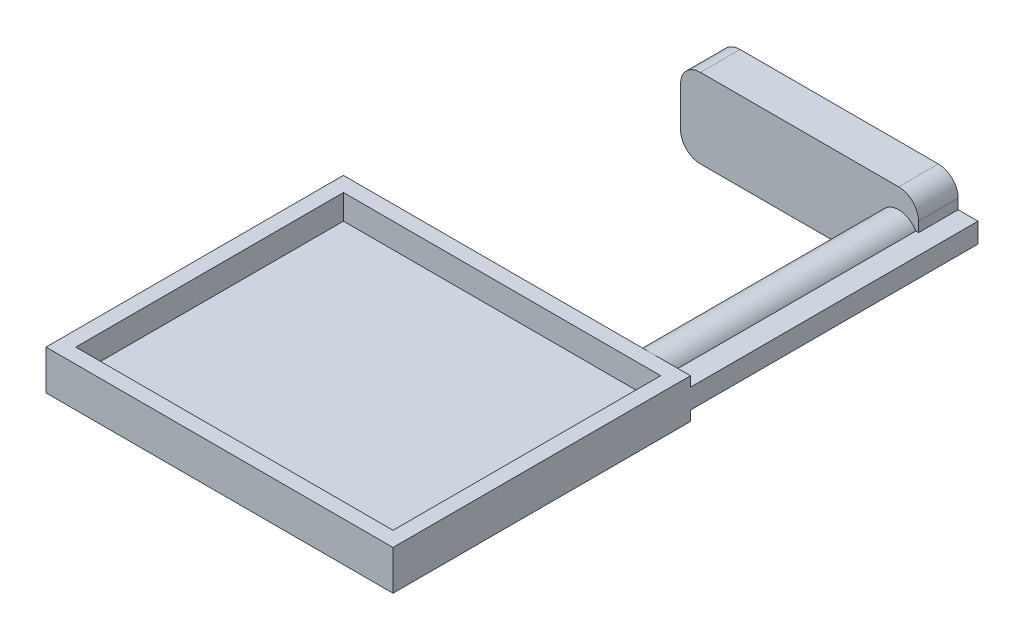
ISO-10303-21;
HEADER;
FILE_DESCRIPTION(('STEP AP214'),'2;1');
FILE_NAME('part.step','',(''),(''),'','','');
FILE_SCHEMA(('AUTOMOTIVE_DESIGN { 1 0 10303 214 1 1 1 1 }'));
ENDSEC;
DATA;
#1=APPLICATION_CONTEXT('core data for automotive mechanical design processes');
#2=APPLICATION_PROTOCOL_DEFINITION('international standard','automotive_design',2000,#1);
#3=PRODUCT_CONTEXT('',#1,'mechanical');
#4=PRODUCT('Part','Part','',(#3));
#5=PRODUCT_RELATED_PRODUCT_CATEGORY('part','',(#4));
#6=PRODUCT_DEFINITION_FORMATION('','',#4);
#7=PRODUCT_DEFINITION_CONTEXT('part definition',#1,'design');
#8=PRODUCT_DEFINITION('design','',#6,#7);
#9=PRODUCT_DEFINITION_SHAPE('','',#8);
#10=(LENGTH_UNIT() NAMED_UNIT(*) SI_UNIT(.MILLI.,.METRE.));
#11=(NAMED_UNIT(*) PLANE_ANGLE_UNIT() SI_UNIT($,.RADIAN.));
#12=(NAMED_UNIT(*) SI_UNIT($,.STERADIAN.) SOLID_ANGLE_UNIT());
#13=UNCERTAINTY_MEASURE_WITH_UNIT(LENGTH_MEASURE(1.E-05),#10,'distance_accuracy_value','');
#14=(GEOMETRIC_REPRESENTATION_CONTEXT(3) GLOBAL_UNCERTAINTY_ASSIGNED_CONTEXT((#13)) GLOBAL_UNIT_ASSIGNED_CONTEXT((#10,
#11,#12)) REPRESENTATION_CONTEXT('',''));
#15=CARTESIAN_POINT('',(0.,0.,0.));
#16=DIRECTION('',(0.,0.,1.));
#17=DIRECTION('',(1.,0.,0.));
#18=AXIS2_PLACEMENT_3D('',#15,#16,#17);
#19=CARTESIAN_POINT('',(3.99999999999998,4.00000000000002,-58.));
#20=DIRECTION('',(-1.,0.,0.));
#21=DIRECTION('',(0.,0.,1.));
#22=AXIS2_PLACEMENT_3D('',#19,#20,#21);
#23=PLANE('',#22);
#24=DIRECTION('',(0.,0.,1.));
#25=VECTOR('',#24,1.);
#26=CARTESIAN_POINT('',(3.99999999999998,-2.,-63.6568542494924));
#27=LINE('',#26,#25);
#28=CARTESIAN_POINT('',(3.99999999999998,-2.,-58.));
#29=VERTEX_POINT('',#28);
#30=CARTESIAN_POINT('',(3.99999999999998,-2.,-50.));
#31=VERTEX_POINT('',#30);
#32=EDGE_CURVE('E328',#29,#31,#27,.T.);
#33=ORIENTED_EDGE('',*,*,#32,.T.);
#34=DIRECTION('',(0.,-1.,0.));
#35=VECTOR('',#34,1.);
#36=CARTESIAN_POINT('',(3.99999999999998,4.00000000000002,-50.));
#37=LINE('',#36,#35);
#38=CARTESIAN_POINT('',(3.99999999999998,-4.00000000000002,-50.));
#39=VERTEX_POINT('',#38);
#40=EDGE_CURVE('E366',#31,#39,#37,.T.);
#41=ORIENTED_EDGE('',*,*,#40,.T.);
#42=DIRECTION('',(0.,0.,1.));
#43=VECTOR('',#42,1.);
#44=CARTESIAN_POINT('',(3.99999999999998,-4.00000000000002,-58.));
#45=LINE('',#44,#43);
#46=CARTESIAN_POINT('',(3.99999999999998,-4.00000000000002,-58.));
#47=VERTEX_POINT('',#46);
#48=EDGE_CURVE('E398',#47,#39,#45,.T.);
#49=ORIENTED_EDGE('',*,*,#48,.F.);
#50=DIRECTION('',(0.,-1.,0.));
#51=VECTOR('',#50,1.);
#52=CARTESIAN_POINT('',(3.99999999999998,4.00000000000002,-58.));
#53=LINE('',#52,#51);
#54=EDGE_CURVE('E346',#29,#47,#53,.T.);
#55=ORIENTED_EDGE('',*,*,#54,.F.);
#56=EDGE_LOOP('',(#33,#41,#49,#55));
#57=FACE_BOUND('',#56,.T.);
#58=ADVANCED_FACE('F41',(#57),#23,.F.);
#59=DIRECTION('',(0.,0.,1.));
#60=VECTOR('',#59,1.);
#61=CARTESIAN_POINT('',(3.99999999999998,2.,-63.6568542494924));
#62=LINE('',#61,#60);
#63=CARTESIAN_POINT('',(3.99999999999998,2.,-58.));
#64=VERTEX_POINT('',#63);
#65=CARTESIAN_POINT('',(3.99999999999998,2.,-50.));
#66=VERTEX_POINT('',#65);
#67=EDGE_CURVE('E339',#64,#66,#62,.T.);
#68=ORIENTED_EDGE('',*,*,#67,.F.);
#69=CARTESIAN_POINT('',(3.99999999999998,4.00000000000002,-58.));
#70=VERTEX_POINT('',#69);
#71=EDGE_CURVE('E348',#70,#64,#53,.T.);
#72=ORIENTED_EDGE('',*,*,#71,.F.);
#73=DIRECTION('',(0.,0.,1.));
#74=VECTOR('',#73,1.);
#75=CARTESIAN_POINT('',(3.99999999999998,4.00000000000002,-58.));
#76=LINE('',#75,#74);
#77=CARTESIAN_POINT('',(3.99999999999998,4.00000000000002,-50.));
#78=VERTEX_POINT('',#77);
#79=EDGE_CURVE('E401',#70,#78,#76,.T.);
#80=ORIENTED_EDGE('',*,*,#79,.T.);
#81=EDGE_CURVE('E367',#78,#66,#37,.T.);
#82=ORIENTED_EDGE('',*,*,#81,.T.);
#83=EDGE_LOOP('',(#68,#72,#80,#82));
#84=FACE_BOUND('',#83,.T.);
#85=ADVANCED_FACE('F494',(#84),#23,.F.);
#86=CARTESIAN_POINT('',(0.,0.,5.));
#87=DIRECTION('',(0.,0.,-1.));
#88=DIRECTION('',(-1.,0.,0.));
#89=AXIS2_PLACEMENT_3D('',#86,#87,#88);
#90=CYLINDRICAL_SURFACE('',#89,4.);
#91=CARTESIAN_POINT('',(0.,0.,0.));
#92=DIRECTION('',(0.,0.,1.));
#93=DIRECTION('',(1.,0.,0.));
#94=AXIS2_PLACEMENT_3D('',#91,#92,#93);
#95=CIRCLE('',#94,4.);
#96=CARTESIAN_POINT('',(3.46410161513775,2.,0.));
#97=VERTEX_POINT('',#96);
#98=CARTESIAN_POINT('',(0.,4.,0.));
#99=VERTEX_POINT('',#98);
#100=EDGE_CURVE('E407',#97,#99,#95,.T.);
#101=ORIENTED_EDGE('',*,*,#100,.F.);
#102=DIRECTION('',(0.,0.,-1.));
#103=VECTOR('',#102,1.);
#104=CARTESIAN_POINT('',(3.46410161513775,2.,5.));
#105=LINE('',#104,#103);
#106=CARTESIAN_POINT('',(3.46410161513775,2.,-50.));
#107=VERTEX_POINT('',#106);
#108=EDGE_CURVE('E419',#97,#107,#105,.T.);
#109=ORIENTED_EDGE('',*,*,#108,.T.);
#110=CARTESIAN_POINT('',(0.,0.,-50.));
#111=DIRECTION('',(0.,0.,1.));
#112=DIRECTION('',(1.,0.,0.));
#113=AXIS2_PLACEMENT_3D('',#110,#111,#112);
#114=CIRCLE('',#113,4.);
#115=CARTESIAN_POINT('',(3.46410161513775,-2.,-50.));
#116=VERTEX_POINT('',#115);
#117=EDGE_CURVE('E410',#107,#116,#114,.T.);
#118=ORIENTED_EDGE('',*,*,#117,.T.);
#119=DIRECTION('',(0.,0.,-1.));
#120=VECTOR('',#119,1.);
#121=CARTESIAN_POINT('',(3.46410161513775,-2.,5.));
#122=LINE('',#121,#120);
#123=CARTESIAN_POINT('',(3.46410161513775,-2.,0.));
#124=VERTEX_POINT('',#123);
#125=EDGE_CURVE('E49',#124,#116,#122,.T.);
#126=ORIENTED_EDGE('',*,*,#125,.F.);
#127=CARTESIAN_POINT('',(0.,-4.,0.));
#128=VERTEX_POINT('',#127);
#129=EDGE_CURVE('E64',#128,#124,#95,.T.);
#130=ORIENTED_EDGE('',*,*,#129,.F.);
#131=EDGE_CURVE('E411',#99,#128,#95,.T.);
#132=ORIENTED_EDGE('',*,*,#131,.F.);
#133=EDGE_LOOP('',(#101,#109,#118,#126,#130,#132));
#134=FACE_BOUND('',#133,.T.);
#135=ADVANCED_FACE('F43',(#134),#90,.T.);
#136=CARTESIAN_POINT('',(8.,-2.,5.));
#137=DIRECTION('',(0.,1.,0.));
#138=DIRECTION('',(0.,0.,1.));
#139=AXIS2_PLACEMENT_3D('',#136,#137,#138);
#140=PLANE('',#139);
#141=DIRECTION('',(1.,0.,0.));
#142=VECTOR('',#141,1.);
#143=CARTESIAN_POINT('',(8.,-2.,0.));
#144=LINE('',#143,#142);
#145=CARTESIAN_POINT('',(8.,-2.,0.));
#146=VERTEX_POINT('',#145);
#147=EDGE_CURVE('E404',#124,#146,#144,.T.);
#148=ORIENTED_EDGE('',*,*,#147,.F.);
#149=ORIENTED_EDGE('',*,*,#125,.T.);
#150=DIRECTION('',(1.,0.,0.));
#151=VECTOR('',#150,1.);
#152=CARTESIAN_POINT('',(8.,-2.,-50.));
#153=LINE('',#152,#151);
#154=EDGE_CURVE('E414',#116,#31,#153,.T.);
#155=ORIENTED_EDGE('',*,*,#154,.T.);
#156=ORIENTED_EDGE('',*,*,#32,.F.);
#157=DIRECTION('',(1.,0.,0.));
#158=VECTOR('',#157,1.);
#159=CARTESIAN_POINT('',(3.99999999999998,-2.,-58.));
#160=LINE('',#159,#158);
#161=CARTESIAN_POINT('',(8.,-2.,-58.));
#162=VERTEX_POINT('',#161);
#163=EDGE_CURVE('E335',#29,#162,#160,.T.);
#164=ORIENTED_EDGE('',*,*,#163,.T.);
#165=DIRECTION('',(0.,0.,-1.));
#166=VECTOR('',#165,1.);
#167=CARTESIAN_POINT('',(8.,-2.,5.));
#168=LINE('',#167,#166);
#169=EDGE_CURVE('E424',#146,#162,#168,.T.);
#170=ORIENTED_EDGE('',*,*,#169,.F.);
#171=EDGE_LOOP('',(#148,#149,#155,#156,#164,#170));
#172=FACE_BOUND('',#171,.T.);
#173=ADVANCED_FACE('F426',(#172),#140,.F.);
#174=CARTESIAN_POINT('',(8.,2.,5.));
#175=DIRECTION('',(-1.,0.,0.));
#176=DIRECTION('',(0.,0.,1.));
#177=AXIS2_PLACEMENT_3D('',#174,#175,#176);
#178=PLANE('',#177);
#179=DIRECTION('',(0.,0.,-1.));
#180=VECTOR('',#179,1.);
#181=CARTESIAN_POINT('',(8.,2.,5.));
#182=LINE('',#181,#180);
#183=CARTESIAN_POINT('',(8.,2.,0.));
#184=VERTEX_POINT('',#183);
#185=CARTESIAN_POINT('',(8.,2.,-58.));
#186=VERTEX_POINT('',#185);
#187=EDGE_CURVE('E422',#184,#186,#182,.T.);
#188=ORIENTED_EDGE('',*,*,#187,.F.);
#189=DIRECTION('',(0.,1.,0.));
#190=VECTOR('',#189,1.);
#191=CARTESIAN_POINT('',(8.,4.,0.));
#192=LINE('',#191,#190);
#193=CARTESIAN_POINT('',(8.,4.,0.));
#194=VERTEX_POINT('',#193);
#195=EDGE_CURVE('E232',#184,#194,#192,.T.);
#196=ORIENTED_EDGE('',*,*,#195,.T.);
#197=DIRECTION('',(0.,0.,-1.));
#198=VECTOR('',#197,1.);
#199=CARTESIAN_POINT('',(8.,4.,60.));
#200=LINE('',#199,#198);
#201=CARTESIAN_POINT('',(8.,4.,60.));
#202=VERTEX_POINT('',#201);
#203=EDGE_CURVE('E267',#202,#194,#200,.T.);
#204=ORIENTED_EDGE('',*,*,#203,.F.);
#205=DIRECTION('',(0.,1.,0.));
#206=VECTOR('',#205,1.);
#207=CARTESIAN_POINT('',(8.,4.,60.));
#208=LINE('',#207,#206);
#209=CARTESIAN_POINT('',(8.,-4.,60.));
#210=VERTEX_POINT('',#209);
#211=EDGE_CURVE('E236',#210,#202,#208,.T.);
#212=ORIENTED_EDGE('',*,*,#211,.F.);
#213=DIRECTION('',(0.,0.,-1.));
#214=VECTOR('',#213,1.);
#215=CARTESIAN_POINT('',(8.,-4.,60.));
#216=LINE('',#215,#214);
#217=CARTESIAN_POINT('',(8.,-4.,0.));
#218=VERTEX_POINT('',#217);
#219=EDGE_CURVE('E246',#210,#218,#216,.T.);
#220=ORIENTED_EDGE('',*,*,#219,.T.);
#221=EDGE_CURVE('E247',#218,#146,#192,.T.);
#222=ORIENTED_EDGE('',*,*,#221,.T.);
#223=ORIENTED_EDGE('',*,*,#169,.T.);
#224=DIRECTION('',(0.,1.,0.));
#225=VECTOR('',#224,1.);
#226=CARTESIAN_POINT('',(8.,2.,-58.));
#227=LINE('',#226,#225);
#228=EDGE_CURVE('E331',#162,#186,#227,.T.);
#229=ORIENTED_EDGE('',*,*,#228,.T.);
#230=EDGE_LOOP('',(#188,#196,#204,#212,#220,#222,#223,#229));
#231=FACE_BOUND('',#230,.T.);
#232=ADVANCED_FACE('F456',(#231),#178,.F.);
#233=CARTESIAN_POINT('',(3.46410161513775,2.,5.));
#234=DIRECTION('',(0.,-1.,0.));
#235=DIRECTION('',(0.,0.,-1.));
#236=AXIS2_PLACEMENT_3D('',#233,#234,#235);
#237=PLANE('',#236);
#238=DIRECTION('',(-1.,0.,0.));
#239=VECTOR('',#238,1.);
#240=CARTESIAN_POINT('',(3.46410161513775,2.,0.));
#241=LINE('',#240,#239);
#242=EDGE_CURVE('E11',#184,#97,#241,.T.);
#243=ORIENTED_EDGE('',*,*,#242,.F.);
#244=ORIENTED_EDGE('',*,*,#187,.T.);
#245=DIRECTION('',(-1.,0.,0.));
#246=VECTOR('',#245,1.);
#247=CARTESIAN_POINT('',(3.99999999999998,2.,-58.));
#248=LINE('',#247,#246);
#249=EDGE_CURVE('E334',#186,#64,#248,.T.);
#250=ORIENTED_EDGE('',*,*,#249,.T.);
#251=ORIENTED_EDGE('',*,*,#67,.T.);
#252=DIRECTION('',(-1.,0.,0.));
#253=VECTOR('',#252,1.);
#254=CARTESIAN_POINT('',(3.46410161513775,2.,-50.));
#255=LINE('',#254,#253);
#256=EDGE_CURVE('E417',#66,#107,#255,.T.);
#257=ORIENTED_EDGE('',*,*,#256,.T.);
#258=ORIENTED_EDGE('',*,*,#108,.F.);
#259=EDGE_LOOP('',(#243,#244,#250,#251,#257,#258));
#260=FACE_BOUND('',#259,.T.);
#261=ADVANCED_FACE('F474',(#260),#237,.F.);
#262=CARTESIAN_POINT('',(0.,4.00000000000002,-50.));
#263=DIRECTION('',(0.,0.,1.));
#264=DIRECTION('',(1.,0.,0.));
#265=AXIS2_PLACEMENT_3D('',#262,#263,#264);
#266=PLANE('',#265);
#267=ORIENTED_EDGE('',*,*,#256,.F.);
#268=ORIENTED_EDGE('',*,*,#81,.F.);
#269=CARTESIAN_POINT('',(0.,4.00000000000002,-50.));
#270=DIRECTION('',(0.,0.,-1.));
#271=DIRECTION('',(1.,0.,0.));
#272=AXIS2_PLACEMENT_3D('',#269,#270,#271);
#273=CIRCLE('',#272,3.99999999999998);
#274=CARTESIAN_POINT('',(0.,8.,-50.));
#275=VERTEX_POINT('',#274);
#276=EDGE_CURVE('E337',#275,#78,#273,.T.);
#277=ORIENTED_EDGE('',*,*,#276,.F.);
#278=DIRECTION('',(1.,0.,0.));
#279=VECTOR('',#278,1.);
#280=CARTESIAN_POINT('',(0.,8.,-50.));
#281=LINE('',#280,#279);
#282=CARTESIAN_POINT('',(-40.,8.00000000000001,-50.));
#283=VERTEX_POINT('',#282);
#284=EDGE_CURVE('E347',#283,#275,#281,.T.);
#285=ORIENTED_EDGE('',*,*,#284,.F.);
#286=CARTESIAN_POINT('',(-40.,4.00000000000002,-50.));
#287=DIRECTION('',(0.,0.,-1.));
#288=DIRECTION('',(-1.,0.,0.));
#289=AXIS2_PLACEMENT_3D('',#286,#287,#288);
#290=CIRCLE('',#289,3.99999999999999);
#291=CARTESIAN_POINT('',(-44.,4.00000000000002,-50.));
#292=VERTEX_POINT('',#291);
#293=EDGE_CURVE('E378',#292,#283,#290,.T.);
#294=ORIENTED_EDGE('',*,*,#293,.F.);
#295=DIRECTION('',(0.,1.,0.));
#296=VECTOR('',#295,1.);
#297=CARTESIAN_POINT('',(-44.,4.00000000000002,-50.));
#298=LINE('',#297,#296);
#299=CARTESIAN_POINT('',(-44.,-4.00000000000002,-50.));
#300=VERTEX_POINT('',#299);
#301=EDGE_CURVE('E376',#300,#292,#298,.T.);
#302=ORIENTED_EDGE('',*,*,#301,.F.);
#303=CARTESIAN_POINT('',(-40.,-4.00000000000002,-50.));
#304=DIRECTION('',(0.,0.,-1.));
#305=DIRECTION('',(-1.,0.,0.));
#306=AXIS2_PLACEMENT_3D('',#303,#304,#305);
#307=CIRCLE('',#306,3.99999999999999);
#308=CARTESIAN_POINT('',(-40.,-8.,-50.));
#309=VERTEX_POINT('',#308);
#310=EDGE_CURVE('E374',#309,#300,#307,.T.);
#311=ORIENTED_EDGE('',*,*,#310,.F.);
#312=DIRECTION('',(-1.,0.,0.));
#313=VECTOR('',#312,1.);
#314=CARTESIAN_POINT('',(0.,-8.,-50.));
#315=LINE('',#314,#313);
#316=CARTESIAN_POINT('',(0.,-7.99999999999999,-50.));
#317=VERTEX_POINT('',#316);
#318=EDGE_CURVE('E372',#317,#309,#315,.T.);
#319=ORIENTED_EDGE('',*,*,#318,.F.);
#320=CARTESIAN_POINT('',(0.,-4.00000000000001,-50.));
#321=DIRECTION('',(0.,0.,-1.));
#322=DIRECTION('',(-1.,0.,0.));
#323=AXIS2_PLACEMENT_3D('',#320,#321,#322);
#324=CIRCLE('',#323,3.99999999999998);
#325=EDGE_CURVE('E370',#39,#317,#324,.T.);
#326=ORIENTED_EDGE('',*,*,#325,.F.);
#327=ORIENTED_EDGE('',*,*,#40,.F.);
#328=ORIENTED_EDGE('',*,*,#154,.F.);
#329=ORIENTED_EDGE('',*,*,#117,.F.);
#330=EDGE_LOOP('',(#267,#268,#277,#285,#294,#302,#311,#319,#326,#327,#328,#329));
#331=FACE_BOUND('',#330,.T.);
#332=ADVANCED_FACE('F433',(#331),#266,.T.);
#333=CARTESIAN_POINT('',(0.,4.00000000000002,-58.));
#334=DIRECTION('',(0.,0.,1.));
#335=DIRECTION('',(1.,0.,0.));
#336=AXIS2_PLACEMENT_3D('',#333,#334,#335);
#337=CYLINDRICAL_SURFACE('',#336,3.99999999999998);
#338=ORIENTED_EDGE('',*,*,#276,.T.);
#339=ORIENTED_EDGE('',*,*,#79,.F.);
#340=CARTESIAN_POINT('',(0.,4.00000000000002,-58.));
#341=DIRECTION('',(0.,0.,-1.));
#342=DIRECTION('',(1.,0.,0.));
#343=AXIS2_PLACEMENT_3D('',#340,#341,#342);
#344=CIRCLE('',#343,3.99999999999998);
#345=CARTESIAN_POINT('',(0.,8.,-58.));
#346=VERTEX_POINT('',#345);
#347=EDGE_CURVE('E343',#346,#70,#344,.T.);
#348=ORIENTED_EDGE('',*,*,#347,.F.);
#349=DIRECTION('',(0.,0.,1.));
#350=VECTOR('',#349,1.);
#351=CARTESIAN_POINT('',(0.,8.,-58.));
#352=LINE('',#351,#350);
#353=EDGE_CURVE('E363',#346,#275,#352,.T.);
#354=ORIENTED_EDGE('',*,*,#353,.T.);
#355=EDGE_LOOP('',(#338,#339,#348,#354));
#356=FACE_BOUND('',#355,.T.);
#357=ADVANCED_FACE('F504',(#356),#337,.T.);
#358=CARTESIAN_POINT('',(0.,-4.00000000000001,-58.));
#359=DIRECTION('',(0.,0.,1.));
#360=DIRECTION('',(1.,0.,0.));
#361=AXIS2_PLACEMENT_3D('',#358,#359,#360);
#362=CYLINDRICAL_SURFACE('',#361,3.99999999999998);
#363=ORIENTED_EDGE('',*,*,#325,.T.);
#364=DIRECTION('',(0.,0.,1.));
#365=VECTOR('',#364,1.);
#366=CARTESIAN_POINT('',(0.,-7.99999999999999,-58.));
#367=LINE('',#366,#365);
#368=CARTESIAN_POINT('',(0.,-7.99999999999999,-58.));
#369=VERTEX_POINT('',#368);
#370=EDGE_CURVE('E395',#369,#317,#367,.T.);
#371=ORIENTED_EDGE('',*,*,#370,.F.);
#372=CARTESIAN_POINT('',(0.,-4.00000000000001,-58.));
#373=DIRECTION('',(0.,0.,-1.));
#374=DIRECTION('',(-1.,0.,0.));
#375=AXIS2_PLACEMENT_3D('',#372,#373,#374);
#376=CIRCLE('',#375,3.99999999999998);
#377=EDGE_CURVE('E351',#47,#369,#376,.T.);
#378=ORIENTED_EDGE('',*,*,#377,.F.);
#379=ORIENTED_EDGE('',*,*,#48,.T.);
#380=EDGE_LOOP('',(#363,#371,#378,#379));
#381=FACE_BOUND('',#380,.T.);
#382=ADVANCED_FACE('F441',(#381),#362,.T.);
#383=CARTESIAN_POINT('',(0.,-8.,-58.));
#384=DIRECTION('',(0.,1.,0.));
#385=DIRECTION('',(-1.,0.,0.));
#386=AXIS2_PLACEMENT_3D('',#383,#384,#385);
#387=PLANE('',#386);
#388=ORIENTED_EDGE('',*,*,#318,.T.);
#389=DIRECTION('',(0.,0.,1.));
#390=VECTOR('',#389,1.);
#391=CARTESIAN_POINT('',(-40.,-8.,-58.));
#392=LINE('',#391,#390);
#393=CARTESIAN_POINT('',(-40.,-8.,-58.));
#394=VERTEX_POINT('',#393);
#395=EDGE_CURVE('E392',#394,#309,#392,.T.);
#396=ORIENTED_EDGE('',*,*,#395,.F.);
#397=DIRECTION('',(-1.,0.,0.));
#398=VECTOR('',#397,1.);
#399=CARTESIAN_POINT('',(0.,-8.,-58.));
#400=LINE('',#399,#398);
#401=EDGE_CURVE('E353',#369,#394,#400,.T.);
#402=ORIENTED_EDGE('',*,*,#401,.F.);
#403=ORIENTED_EDGE('',*,*,#370,.T.);
#404=EDGE_LOOP('',(#388,#396,#402,#403));
#405=FACE_BOUND('',#404,.T.);
#406=ADVANCED_FACE('F902',(#405),#387,.F.);
#407=CARTESIAN_POINT('',(-40.,-4.00000000000002,-58.));
#408=DIRECTION('',(0.,0.,1.));
#409=DIRECTION('',(1.,0.,0.));
#410=AXIS2_PLACEMENT_3D('',#407,#408,#409);
#411=CYLINDRICAL_SURFACE('',#410,3.99999999999999);
#412=ORIENTED_EDGE('',*,*,#310,.T.);
#413=DIRECTION('',(0.,0.,1.));
#414=VECTOR('',#413,1.);
#415=CARTESIAN_POINT('',(-44.,-4.00000000000002,-58.));
#416=LINE('',#415,#414);
#417=CARTESIAN_POINT('',(-44.,-4.00000000000002,-58.));
#418=VERTEX_POINT('',#417);
#419=EDGE_CURVE('E389',#418,#300,#416,.T.);
#420=ORIENTED_EDGE('',*,*,#419,.F.);
#421=CARTESIAN_POINT('',(-40.,-4.00000000000002,-58.));
#422=DIRECTION('',(0.,0.,-1.));
#423=DIRECTION('',(-1.,0.,0.));
#424=AXIS2_PLACEMENT_3D('',#421,#422,#423);
#425=CIRCLE('',#424,3.99999999999999);
#426=EDGE_CURVE('E355',#394,#418,#425,.T.);
#427=ORIENTED_EDGE('',*,*,#426,.F.);
#428=ORIENTED_EDGE('',*,*,#395,.T.);
#429=EDGE_LOOP('',(#412,#420,#427,#428));
#430=FACE_BOUND('',#429,.T.);
#431=ADVANCED_FACE('F893',(#430),#411,.T.);
#432=CARTESIAN_POINT('',(-44.,4.00000000000002,-58.));
#433=DIRECTION('',(1.,0.,0.));
#434=DIRECTION('',(0.,0.,-1.));
#435=AXIS2_PLACEMENT_3D('',#432,#433,#434);
#436=PLANE('',#435);
#437=ORIENTED_EDGE('',*,*,#301,.T.);
#438=DIRECTION('',(0.,0.,1.));
#439=VECTOR('',#438,1.);
#440=CARTESIAN_POINT('',(-44.,4.00000000000002,-58.));
#441=LINE('',#440,#439);
#442=CARTESIAN_POINT('',(-44.,4.00000000000002,-58.));
#443=VERTEX_POINT('',#442);
#444=EDGE_CURVE('E386',#443,#292,#441,.T.);
#445=ORIENTED_EDGE('',*,*,#444,.F.);
#446=DIRECTION('',(0.,1.,0.));
#447=VECTOR('',#446,1.);
#448=CARTESIAN_POINT('',(-44.,4.00000000000002,-58.));
#449=LINE('',#448,#447);
#450=EDGE_CURVE('E357',#418,#443,#449,.T.);
#451=ORIENTED_EDGE('',*,*,#450,.F.);
#452=ORIENTED_EDGE('',*,*,#419,.T.);
#453=EDGE_LOOP('',(#437,#445,#451,#452));
#454=FACE_BOUND('',#453,.T.);
#455=ADVANCED_FACE('F884',(#454),#436,.F.);
#456=CARTESIAN_POINT('',(-40.,4.00000000000002,-58.));
#457=DIRECTION('',(0.,0.,1.));
#458=DIRECTION('',(1.,0.,0.));
#459=AXIS2_PLACEMENT_3D('',#456,#457,#458);
#460=CYLINDRICAL_SURFACE('',#459,3.99999999999999);
#461=ORIENTED_EDGE('',*,*,#293,.T.);
#462=DIRECTION('',(0.,0.,1.));
#463=VECTOR('',#462,1.);
#464=CARTESIAN_POINT('',(-40.,8.00000000000001,-58.));
#465=LINE('',#464,#463);
#466=CARTESIAN_POINT('',(-40.,8.00000000000001,-58.));
#467=VERTEX_POINT('',#466);
#468=EDGE_CURVE('E383',#467,#283,#465,.T.);
#469=ORIENTED_EDGE('',*,*,#468,.F.);
#470=CARTESIAN_POINT('',(-40.,4.00000000000002,-58.));
#471=DIRECTION('',(0.,0.,-1.));
#472=DIRECTION('',(-1.,0.,0.));
#473=AXIS2_PLACEMENT_3D('',#470,#471,#472);
#474=CIRCLE('',#473,3.99999999999999);
#475=EDGE_CURVE('E359',#443,#467,#474,.T.);
#476=ORIENTED_EDGE('',*,*,#475,.F.);
#477=ORIENTED_EDGE('',*,*,#444,.T.);
#478=EDGE_LOOP('',(#461,#469,#476,#477));
#479=FACE_BOUND('',#478,.T.);
#480=ADVANCED_FACE('F875',(#479),#460,.T.);
#481=CARTESIAN_POINT('',(0.,8.,-58.));
#482=DIRECTION('',(0.,-1.,0.));
#483=DIRECTION('',(1.,0.,0.));
#484=AXIS2_PLACEMENT_3D('',#481,#482,#483);
#485=PLANE('',#484);
#486=ORIENTED_EDGE('',*,*,#284,.T.);
#487=ORIENTED_EDGE('',*,*,#353,.F.);
#488=DIRECTION('',(1.,0.,0.));
#489=VECTOR('',#488,1.);
#490=CARTESIAN_POINT('',(0.,8.,-58.));
#491=LINE('',#490,#489);
#492=EDGE_CURVE('E361',#467,#346,#491,.T.);
#493=ORIENTED_EDGE('',*,*,#492,.F.);
#494=ORIENTED_EDGE('',*,*,#468,.T.);
#495=EDGE_LOOP('',(#486,#487,#493,#494));
#496=FACE_BOUND('',#495,.T.);
#497=ADVANCED_FACE('F706',(#496),#485,.F.);
#498=CARTESIAN_POINT('',(0.,4.00000000000002,-58.));
#499=DIRECTION('',(0.,0.,1.));
#500=DIRECTION('',(1.,0.,0.));
#501=AXIS2_PLACEMENT_3D('',#498,#499,#500);
#502=PLANE('',#501);
#503=CARTESIAN_POINT('',(-20.,-4.00000000000001,-58.));
#504=DIRECTION('',(0.,0.,-1.));
#505=DIRECTION('',(-1.,0.,0.));
#506=AXIS2_PLACEMENT_3D('',#503,#504,#505);
#507=CIRCLE('',#506,3.2);
#508=CARTESIAN_POINT('',(-23.2,-4.00000000000001,-58.));
#509=VERTEX_POINT('',#508);
#510=EDGE_CURVE('E296',#509,#509,#507,.T.);
#511=ORIENTED_EDGE('',*,*,#510,.F.);
#512=EDGE_LOOP('',(#511));
#513=FACE_BOUND('',#512,.T.);
#514=CARTESIAN_POINT('',(-10.,-4.00000000000001,-58.));
#515=DIRECTION('',(0.,0.,-1.));
#516=DIRECTION('',(-1.,0.,0.));
#517=AXIS2_PLACEMENT_3D('',#514,#515,#516);
#518=CIRCLE('',#517,3.2);
#519=CARTESIAN_POINT('',(-13.2,-4.00000000000001,-58.));
#520=VERTEX_POINT('',#519);
#521=EDGE_CURVE('E290',#520,#520,#518,.T.);
#522=ORIENTED_EDGE('',*,*,#521,.F.);
#523=EDGE_LOOP('',(#522));
#524=FACE_BOUND('',#523,.T.);
#525=CARTESIAN_POINT('',(-30.,4.00000000000002,-58.));
#526=DIRECTION('',(0.,0.,-1.));
#527=DIRECTION('',(-1.,0.,0.));
#528=AXIS2_PLACEMENT_3D('',#525,#526,#527);
#529=CIRCLE('',#528,3.2);
#530=CARTESIAN_POINT('',(-33.2,4.00000000000002,-58.));
#531=VERTEX_POINT('',#530);
#532=EDGE_CURVE('E284',#531,#531,#529,.T.);
#533=ORIENTED_EDGE('',*,*,#532,.F.);
#534=EDGE_LOOP('',(#533));
#535=FACE_BOUND('',#534,.T.);
#536=CARTESIAN_POINT('',(-20.,4.00000000000002,-58.));
#537=DIRECTION('',(0.,0.,-1.));
#538=DIRECTION('',(-1.,0.,0.));
#539=AXIS2_PLACEMENT_3D('',#536,#537,#538);
#540=CIRCLE('',#539,3.2);
#541=CARTESIAN_POINT('',(-23.2,4.00000000000002,-58.));
#542=VERTEX_POINT('',#541);
#543=EDGE_CURVE('E277',#542,#542,#540,.T.);
#544=ORIENTED_EDGE('',*,*,#543,.F.);
#545=EDGE_LOOP('',(#544));
#546=FACE_BOUND('',#545,.T.);
#547=CARTESIAN_POINT('',(-9.99999999999999,4.00000000000002,-58.));
#548=DIRECTION('',(0.,0.,-1.));
#549=DIRECTION('',(-1.,0.,0.));
#550=AXIS2_PLACEMENT_3D('',#547,#548,#549);
#551=CIRCLE('',#550,3.2);
#552=CARTESIAN_POINT('',(-13.2,4.00000000000002,-58.));
#553=VERTEX_POINT('',#552);
#554=EDGE_CURVE('E320',#553,#553,#551,.T.);
#555=ORIENTED_EDGE('',*,*,#554,.F.);
#556=EDGE_LOOP('',(#555));
#557=FACE_BOUND('',#556,.T.);
#558=CARTESIAN_POINT('',(0.,-4.00000000000001,-58.));
#559=DIRECTION('',(0.,0.,-1.));
#560=DIRECTION('',(-1.,0.,0.));
#561=AXIS2_PLACEMENT_3D('',#558,#559,#560);
#562=CIRCLE('',#561,3.2);
#563=CARTESIAN_POINT('',(-3.2,-4.00000000000001,-58.));
#564=VERTEX_POINT('',#563);
#565=EDGE_CURVE('E314',#564,#564,#562,.T.);
#566=ORIENTED_EDGE('',*,*,#565,.F.);
#567=EDGE_LOOP('',(#566));
#568=FACE_BOUND('',#567,.T.);
#569=CARTESIAN_POINT('',(-40.,-4.00000000000002,-58.));
#570=DIRECTION('',(0.,0.,-1.));
#571=DIRECTION('',(-1.,0.,0.));
#572=AXIS2_PLACEMENT_3D('',#569,#570,#571);
#573=CIRCLE('',#572,3.2);
#574=CARTESIAN_POINT('',(-43.2,-4.00000000000002,-58.));
#575=VERTEX_POINT('',#574);
#576=EDGE_CURVE('E308',#575,#575,#573,.T.);
#577=ORIENTED_EDGE('',*,*,#576,.F.);
#578=EDGE_LOOP('',(#577));
#579=FACE_BOUND('',#578,.T.);
#580=CARTESIAN_POINT('',(-40.,4.00000000000002,-58.));
#581=DIRECTION('',(0.,0.,-1.));
#582=DIRECTION('',(-1.,0.,0.));
#583=AXIS2_PLACEMENT_3D('',#580,#581,#582);
#584=CIRCLE('',#583,3.2);
#585=CARTESIAN_POINT('',(-43.2,4.00000000000002,-58.));
#586=VERTEX_POINT('',#585);
#587=EDGE_CURVE('E301',#586,#586,#584,.T.);
#588=ORIENTED_EDGE('',*,*,#587,.F.);
#589=EDGE_LOOP('',(#588));
#590=FACE_BOUND('',#589,.T.);
#591=CARTESIAN_POINT('',(-30.,-4.00000000000001,-58.));
#592=DIRECTION('',(0.,0.,-1.));
#593=DIRECTION('',(-1.,0.,0.));
#594=AXIS2_PLACEMENT_3D('',#591,#592,#593);
#595=CIRCLE('',#594,3.2);
#596=CARTESIAN_POINT('',(-33.2,-4.00000000000001,-58.));
#597=VERTEX_POINT('',#596);
#598=EDGE_CURVE('E271',#597,#597,#595,.T.);
#599=ORIENTED_EDGE('',*,*,#598,.F.);
#600=EDGE_LOOP('',(#599));
#601=FACE_BOUND('',#600,.T.);
#602=CARTESIAN_POINT('',(0.,4.00000000000002,-58.));
#603=DIRECTION('',(0.,0.,-1.));
#604=DIRECTION('',(-1.,0.,0.));
#605=AXIS2_PLACEMENT_3D('',#602,#603,#604);
#606=CIRCLE('',#605,3.2);
#607=CARTESIAN_POINT('',(-3.2,4.00000000000002,-58.));
#608=VERTEX_POINT('',#607);
#609=EDGE_CURVE('E304',#608,#608,#606,.T.);
#610=ORIENTED_EDGE('',*,*,#609,.F.);
#611=EDGE_LOOP('',(#610));
#612=FACE_BOUND('',#611,.T.);
#613=ORIENTED_EDGE('',*,*,#347,.T.);
#614=ORIENTED_EDGE('',*,*,#71,.T.);
#615=ORIENTED_EDGE('',*,*,#249,.F.);
#616=ORIENTED_EDGE('',*,*,#228,.F.);
#617=ORIENTED_EDGE('',*,*,#163,.F.);
#618=ORIENTED_EDGE('',*,*,#54,.T.);
#619=ORIENTED_EDGE('',*,*,#377,.T.);
#620=ORIENTED_EDGE('',*,*,#401,.T.);
#621=ORIENTED_EDGE('',*,*,#426,.T.);
#622=ORIENTED_EDGE('',*,*,#450,.T.);
#623=ORIENTED_EDGE('',*,*,#475,.T.);
#624=ORIENTED_EDGE('',*,*,#492,.T.);
#625=EDGE_LOOP('',(#613,#614,#615,#616,#617,#618,#619,#620,#621,#622,#623,#624));
#626=FACE_BOUND('',#625,.T.);
#627=ADVANCED_FACE('F445',(#513,#524,#535,#546,#557,#568,#579,#590,#601,#612,#626),#502,.F.);
#628=CARTESIAN_POINT('',(0.,4.00000000000002,-54.95));
#629=DIRECTION('',(0.,0.,-1.));
#630=DIRECTION('',(-1.,0.,0.));
#631=AXIS2_PLACEMENT_3D('',#628,#629,#630);
#632=CYLINDRICAL_SURFACE('',#631,3.2);
#633=CARTESIAN_POINT('',(0.,4.00000000000002,-54.95));
#634=DIRECTION('',(0.,0.,-1.));
#635=DIRECTION('',(-1.,0.,0.));
#636=AXIS2_PLACEMENT_3D('',#633,#634,#635);
#637=CIRCLE('',#636,3.2);
#638=CARTESIAN_POINT('',(-3.2,4.00000000000002,-54.95));
#639=VERTEX_POINT('',#638);
#640=EDGE_CURVE('E325',#639,#639,#637,.T.);
#641=ORIENTED_EDGE('',*,*,#640,.F.);
#642=EDGE_LOOP('',(#641));
#643=FACE_BOUND('',#642,.T.);
#644=ORIENTED_EDGE('',*,*,#609,.T.);
#645=EDGE_LOOP('',(#644));
#646=FACE_BOUND('',#645,.T.);
#647=ADVANCED_FACE('F689',(#643,#646),#632,.F.);
#648=CARTESIAN_POINT('',(0.,4.00000000000002,-54.95));
#649=DIRECTION('',(0.,0.,-1.));
#650=DIRECTION('',(-1.,0.,0.));
#651=AXIS2_PLACEMENT_3D('',#648,#649,#650);
#652=PLANE('',#651);
#653=ORIENTED_EDGE('',*,*,#640,.T.);
#654=EDGE_LOOP('',(#653));
#655=FACE_BOUND('',#654,.T.);
#656=ADVANCED_FACE('F680',(#655),#652,.T.);
#657=CARTESIAN_POINT('',(-30.,-4.00000000000001,-54.95));
#658=DIRECTION('',(0.,0.,-1.));
#659=DIRECTION('',(-1.,0.,0.));
#660=AXIS2_PLACEMENT_3D('',#657,#658,#659);
#661=CYLINDRICAL_SURFACE('',#660,3.2);
#662=CARTESIAN_POINT('',(-30.,-4.00000000000001,-54.95));
#663=DIRECTION('',(0.,0.,-1.));
#664=DIRECTION('',(-1.,0.,0.));
#665=AXIS2_PLACEMENT_3D('',#662,#663,#664);
#666=CIRCLE('',#665,3.2);
#667=CARTESIAN_POINT('',(-33.2,-4.00000000000001,-54.95));
#668=VERTEX_POINT('',#667);
#669=EDGE_CURVE('E270',#668,#668,#666,.T.);
#670=ORIENTED_EDGE('',*,*,#669,.F.);
#671=EDGE_LOOP('',(#670));
#672=FACE_BOUND('',#671,.T.);
#673=ORIENTED_EDGE('',*,*,#598,.T.);
#674=EDGE_LOOP('',(#673));
#675=FACE_BOUND('',#674,.T.);
#676=ADVANCED_FACE('F671',(#672,#675),#661,.F.);
#677=CARTESIAN_POINT('',(-30.,-4.00000000000001,-54.95));
#678=DIRECTION('',(0.,0.,-1.));
#679=DIRECTION('',(-1.,0.,0.));
#680=AXIS2_PLACEMENT_3D('',#677,#678,#679);
#681=PLANE('',#680);
#682=ORIENTED_EDGE('',*,*,#669,.T.);
#683=EDGE_LOOP('',(#682));
#684=FACE_BOUND('',#683,.T.);
#685=ADVANCED_FACE('F662',(#684),#681,.T.);
#686=CARTESIAN_POINT('',(-40.,4.00000000000002,-54.95));
#687=DIRECTION('',(0.,0.,-1.));
#688=DIRECTION('',(-1.,0.,0.));
#689=AXIS2_PLACEMENT_3D('',#686,#687,#688);
#690=CYLINDRICAL_SURFACE('',#689,3.2);
#691=CARTESIAN_POINT('',(-40.,4.00000000000002,-54.95));
#692=DIRECTION('',(0.,0.,-1.));
#693=DIRECTION('',(-1.,0.,0.));
#694=AXIS2_PLACEMENT_3D('',#691,#692,#693);
#695=CIRCLE('',#694,3.2);
#696=CARTESIAN_POINT('',(-43.2,4.00000000000002,-54.95));
#697=VERTEX_POINT('',#696);
#698=EDGE_CURVE('E305',#697,#697,#695,.T.);
#699=ORIENTED_EDGE('',*,*,#698,.F.);
#700=EDGE_LOOP('',(#699));
#701=FACE_BOUND('',#700,.T.);
#702=ORIENTED_EDGE('',*,*,#587,.T.);
#703=EDGE_LOOP('',(#702));
#704=FACE_BOUND('',#703,.T.);
#705=ADVANCED_FACE('F653',(#701,#704),#690,.F.);
#706=CARTESIAN_POINT('',(-40.,4.00000000000002,-54.95));
#707=DIRECTION('',(0.,0.,-1.));
#708=DIRECTION('',(-1.,0.,0.));
#709=AXIS2_PLACEMENT_3D('',#706,#707,#708);
#710=PLANE('',#709);
#711=ORIENTED_EDGE('',*,*,#698,.T.);
#712=EDGE_LOOP('',(#711));
#713=FACE_BOUND('',#712,.T.);
#714=ADVANCED_FACE('F644',(#713),#710,.T.);
#715=CARTESIAN_POINT('',(-40.,-4.00000000000002,-54.95));
#716=DIRECTION('',(0.,0.,-1.));
#717=DIRECTION('',(-1.,0.,0.));
#718=AXIS2_PLACEMENT_3D('',#715,#716,#717);
#719=CYLINDRICAL_SURFACE('',#718,3.2);
#720=CARTESIAN_POINT('',(-40.,-4.00000000000002,-54.95));
#721=DIRECTION('',(0.,0.,-1.));
#722=DIRECTION('',(-1.,0.,0.));
#723=AXIS2_PLACEMENT_3D('',#720,#721,#722);
#724=CIRCLE('',#723,3.2);
#725=CARTESIAN_POINT('',(-43.2,-4.00000000000002,-54.95));
#726=VERTEX_POINT('',#725);
#727=EDGE_CURVE('E311',#726,#726,#724,.T.);
#728=ORIENTED_EDGE('',*,*,#727,.F.);
#729=EDGE_LOOP('',(#728));
#730=FACE_BOUND('',#729,.T.);
#731=ORIENTED_EDGE('',*,*,#576,.T.);
#732=EDGE_LOOP('',(#731));
#733=FACE_BOUND('',#732,.T.);
#734=ADVANCED_FACE('F635',(#730,#733),#719,.F.);
#735=CARTESIAN_POINT('',(-40.,-4.00000000000002,-54.95));
#736=DIRECTION('',(0.,0.,-1.));
#737=DIRECTION('',(-1.,0.,0.));
#738=AXIS2_PLACEMENT_3D('',#735,#736,#737);
#739=PLANE('',#738);
#740=ORIENTED_EDGE('',*,*,#727,.T.);
#741=EDGE_LOOP('',(#740));
#742=FACE_BOUND('',#741,.T.);
#743=ADVANCED_FACE('F626',(#742),#739,.T.);
#744=CARTESIAN_POINT('',(0.,-4.00000000000001,-54.95));
#745=DIRECTION('',(0.,0.,-1.));
#746=DIRECTION('',(-1.,0.,0.));
#747=AXIS2_PLACEMENT_3D('',#744,#745,#746);
#748=CYLINDRICAL_SURFACE('',#747,3.2);
#749=CARTESIAN_POINT('',(0.,-4.00000000000001,-54.95));
#750=DIRECTION('',(0.,0.,-1.));
#751=DIRECTION('',(-1.,0.,0.));
#752=AXIS2_PLACEMENT_3D('',#749,#750,#751);
#753=CIRCLE('',#752,3.2);
#754=CARTESIAN_POINT('',(-3.2,-4.00000000000001,-54.95));
#755=VERTEX_POINT('',#754);
#756=EDGE_CURVE('E317',#755,#755,#753,.T.);
#757=ORIENTED_EDGE('',*,*,#756,.F.);
#758=EDGE_LOOP('',(#757));
#759=FACE_BOUND('',#758,.T.);
#760=ORIENTED_EDGE('',*,*,#565,.T.);
#761=EDGE_LOOP('',(#760));
#762=FACE_BOUND('',#761,.T.);
#763=ADVANCED_FACE('F617',(#759,#762),#748,.F.);
#764=CARTESIAN_POINT('',(0.,-4.00000000000001,-54.95));
#765=DIRECTION('',(0.,0.,-1.));
#766=DIRECTION('',(-1.,0.,0.));
#767=AXIS2_PLACEMENT_3D('',#764,#765,#766);
#768=PLANE('',#767);
#769=ORIENTED_EDGE('',*,*,#756,.T.);
#770=EDGE_LOOP('',(#769));
#771=FACE_BOUND('',#770,.T.);
#772=ADVANCED_FACE('F608',(#771),#768,.T.);
#773=CARTESIAN_POINT('',(-9.99999999999999,4.00000000000002,-54.95));
#774=DIRECTION('',(0.,0.,-1.));
#775=DIRECTION('',(-1.,0.,0.));
#776=AXIS2_PLACEMENT_3D('',#773,#774,#775);
#777=CYLINDRICAL_SURFACE('',#776,3.2);
#778=CARTESIAN_POINT('',(-9.99999999999999,4.00000000000002,-54.95));
#779=DIRECTION('',(0.,0.,-1.));
#780=DIRECTION('',(-1.,0.,0.));
#781=AXIS2_PLACEMENT_3D('',#778,#779,#780);
#782=CIRCLE('',#781,3.2);
#783=CARTESIAN_POINT('',(-13.2,4.00000000000002,-54.95));
#784=VERTEX_POINT('',#783);
#785=EDGE_CURVE('E280',#784,#784,#782,.T.);
#786=ORIENTED_EDGE('',*,*,#785,.F.);
#787=EDGE_LOOP('',(#786));
#788=FACE_BOUND('',#787,.T.);
#789=ORIENTED_EDGE('',*,*,#554,.T.);
#790=EDGE_LOOP('',(#789));
#791=FACE_BOUND('',#790,.T.);
#792=ADVANCED_FACE('F599',(#788,#791),#777,.F.);
#793=CARTESIAN_POINT('',(-9.99999999999999,4.00000000000002,-54.95));
#794=DIRECTION('',(0.,0.,-1.));
#795=DIRECTION('',(-1.,0.,0.));
#796=AXIS2_PLACEMENT_3D('',#793,#794,#795);
#797=PLANE('',#796);
#798=ORIENTED_EDGE('',*,*,#785,.T.);
#799=EDGE_LOOP('',(#798));
#800=FACE_BOUND('',#799,.T.);
#801=ADVANCED_FACE('F590',(#800),#797,.T.);
#802=CARTESIAN_POINT('',(-20.,4.00000000000002,-54.95));
#803=DIRECTION('',(0.,0.,-1.));
#804=DIRECTION('',(-1.,0.,0.));
#805=AXIS2_PLACEMENT_3D('',#802,#803,#804);
#806=CYLINDRICAL_SURFACE('',#805,3.2);
#807=CARTESIAN_POINT('',(-20.,4.00000000000002,-54.95));
#808=DIRECTION('',(0.,0.,-1.));
#809=DIRECTION('',(-1.,0.,0.));
#810=AXIS2_PLACEMENT_3D('',#807,#808,#809);
#811=CIRCLE('',#810,3.2);
#812=CARTESIAN_POINT('',(-23.2,4.00000000000002,-54.95));
#813=VERTEX_POINT('',#812);
#814=EDGE_CURVE('E281',#813,#813,#811,.T.);
#815=ORIENTED_EDGE('',*,*,#814,.F.);
#816=EDGE_LOOP('',(#815));
#817=FACE_BOUND('',#816,.T.);
#818=ORIENTED_EDGE('',*,*,#543,.T.);
#819=EDGE_LOOP('',(#818));
#820=FACE_BOUND('',#819,.T.);
#821=ADVANCED_FACE('F581',(#817,#820),#806,.F.);
#822=CARTESIAN_POINT('',(-20.,4.00000000000002,-54.95));
#823=DIRECTION('',(0.,0.,-1.));
#824=DIRECTION('',(-1.,0.,0.));
#825=AXIS2_PLACEMENT_3D('',#822,#823,#824);
#826=PLANE('',#825);
#827=ORIENTED_EDGE('',*,*,#814,.T.);
#828=EDGE_LOOP('',(#827));
#829=FACE_BOUND('',#828,.T.);
#830=ADVANCED_FACE('F572',(#829),#826,.T.);
#831=CARTESIAN_POINT('',(-30.,4.00000000000002,-54.95));
#832=DIRECTION('',(0.,0.,-1.));
#833=DIRECTION('',(-1.,0.,0.));
#834=AXIS2_PLACEMENT_3D('',#831,#832,#833);
#835=CYLINDRICAL_SURFACE('',#834,3.2);
#836=CARTESIAN_POINT('',(-30.,4.00000000000002,-54.95));
#837=DIRECTION('',(0.,0.,-1.));
#838=DIRECTION('',(-1.,0.,0.));
#839=AXIS2_PLACEMENT_3D('',#836,#837,#838);
#840=CIRCLE('',#839,3.2);
#841=CARTESIAN_POINT('',(-33.2,4.00000000000002,-54.95));
#842=VERTEX_POINT('',#841);
#843=EDGE_CURVE('E287',#842,#842,#840,.T.);
#844=ORIENTED_EDGE('',*,*,#843,.F.);
#845=EDGE_LOOP('',(#844));
#846=FACE_BOUND('',#845,.T.);
#847=ORIENTED_EDGE('',*,*,#532,.T.);
#848=EDGE_LOOP('',(#847));
#849=FACE_BOUND('',#848,.T.);
#850=ADVANCED_FACE('F563',(#846,#849),#835,.F.);
#851=CARTESIAN_POINT('',(-30.,4.00000000000002,-54.95));
#852=DIRECTION('',(0.,0.,-1.));
#853=DIRECTION('',(-1.,0.,0.));
#854=AXIS2_PLACEMENT_3D('',#851,#852,#853);
#855=PLANE('',#854);
#856=ORIENTED_EDGE('',*,*,#843,.T.);
#857=EDGE_LOOP('',(#856));
#858=FACE_BOUND('',#857,.T.);
#859=ADVANCED_FACE('F554',(#858),#855,.T.);
#860=CARTESIAN_POINT('',(-10.,-4.00000000000001,-54.95));
#861=DIRECTION('',(0.,0.,-1.));
#862=DIRECTION('',(-1.,0.,0.));
#863=AXIS2_PLACEMENT_3D('',#860,#861,#862);
#864=CYLINDRICAL_SURFACE('',#863,3.2);
#865=CARTESIAN_POINT('',(-10.,-4.00000000000001,-54.95));
#866=DIRECTION('',(0.,0.,-1.));
#867=DIRECTION('',(-1.,0.,0.));
#868=AXIS2_PLACEMENT_3D('',#865,#866,#867);
#869=CIRCLE('',#868,3.2);
#870=CARTESIAN_POINT('',(-13.2,-4.00000000000001,-54.95));
#871=VERTEX_POINT('',#870);
#872=EDGE_CURVE('E293',#871,#871,#869,.T.);
#873=ORIENTED_EDGE('',*,*,#872,.F.);
#874=EDGE_LOOP('',(#873));
#875=FACE_BOUND('',#874,.T.);
#876=ORIENTED_EDGE('',*,*,#521,.T.);
#877=EDGE_LOOP('',(#876));
#878=FACE_BOUND('',#877,.T.);
#879=ADVANCED_FACE('F545',(#875,#878),#864,.F.);
#880=CARTESIAN_POINT('',(-10.,-4.00000000000001,-54.95));
#881=DIRECTION('',(0.,0.,-1.));
#882=DIRECTION('',(-1.,0.,0.));
#883=AXIS2_PLACEMENT_3D('',#880,#881,#882);
#884=PLANE('',#883);
#885=ORIENTED_EDGE('',*,*,#872,.T.);
#886=EDGE_LOOP('',(#885));
#887=FACE_BOUND('',#886,.T.);
#888=ADVANCED_FACE('F536',(#887),#884,.T.);
#889=CARTESIAN_POINT('',(-20.,-4.00000000000001,-54.95));
#890=DIRECTION('',(0.,0.,-1.));
#891=DIRECTION('',(-1.,0.,0.));
#892=AXIS2_PLACEMENT_3D('',#889,#890,#891);
#893=CYLINDRICAL_SURFACE('',#892,3.2);
#894=CARTESIAN_POINT('',(-20.,-4.00000000000001,-54.95));
#895=DIRECTION('',(0.,0.,-1.));
#896=DIRECTION('',(-1.,0.,0.));
#897=AXIS2_PLACEMENT_3D('',#894,#895,#896);
#898=CIRCLE('',#897,3.2);
#899=CARTESIAN_POINT('',(-23.2,-4.00000000000001,-54.95));
#900=VERTEX_POINT('',#899);
#901=EDGE_CURVE('E274',#900,#900,#898,.T.);
#902=ORIENTED_EDGE('',*,*,#901,.F.);
#903=EDGE_LOOP('',(#902));
#904=FACE_BOUND('',#903,.T.);
#905=ORIENTED_EDGE('',*,*,#510,.T.);
#906=EDGE_LOOP('',(#905));
#907=FACE_BOUND('',#906,.T.);
#908=ADVANCED_FACE('F526',(#904,#907),#893,.F.);
#909=CARTESIAN_POINT('',(-20.,-4.00000000000001,-54.95));
#910=DIRECTION('',(0.,0.,-1.));
#911=DIRECTION('',(-1.,0.,0.));
#912=AXIS2_PLACEMENT_3D('',#909,#910,#911);
#913=PLANE('',#912);
#914=ORIENTED_EDGE('',*,*,#901,.T.);
#915=EDGE_LOOP('',(#914));
#916=FACE_BOUND('',#915,.T.);
#917=ADVANCED_FACE('F522',(#916),#913,.T.);
#918=CARTESIAN_POINT('',(0.,0.,0.));
#919=DIRECTION('',(0.,0.,-1.));
#920=DIRECTION('',(-1.,0.,0.));
#921=AXIS2_PLACEMENT_3D('',#918,#919,#920);
#922=PLANE('',#921);
#923=ORIENTED_EDGE('',*,*,#129,.T.);
#924=ORIENTED_EDGE('',*,*,#147,.T.);
#925=ORIENTED_EDGE('',*,*,#221,.F.);
#926=DIRECTION('',(1.,0.,0.));
#927=VECTOR('',#926,1.);
#928=CARTESIAN_POINT('',(8.,-4.,0.));
#929=LINE('',#928,#927);
#930=EDGE_CURVE('E256',#128,#218,#929,.T.);
#931=ORIENTED_EDGE('',*,*,#930,.F.);
#932=EDGE_LOOP('',(#923,#924,#925,#931));
#933=FACE_BOUND('',#932,.T.);
#934=ADVANCED_FACE('F453',(#933),#922,.T.);
#935=DIRECTION('',(-1.,0.,0.));
#936=VECTOR('',#935,1.);
#937=CARTESIAN_POINT('',(8.,4.,0.));
#938=LINE('',#937,#936);
#939=CARTESIAN_POINT('',(-62.,3.99999999999999,0.));
#940=VERTEX_POINT('',#939);
#941=EDGE_CURVE('E250',#99,#940,#938,.T.);
#942=ORIENTED_EDGE('',*,*,#941,.F.);
#943=ORIENTED_EDGE('',*,*,#131,.T.);
#944=CARTESIAN_POINT('',(-62.,-4.00000000000001,0.));
#945=VERTEX_POINT('',#944);
#946=EDGE_CURVE('E240',#945,#128,#929,.T.);
#947=ORIENTED_EDGE('',*,*,#946,.F.);
#948=DIRECTION('',(0.,-1.,0.));
#949=VECTOR('',#948,1.);
#950=CARTESIAN_POINT('',(-62.,3.99999999999999,0.));
#951=LINE('',#950,#949);
#952=EDGE_CURVE('E254',#940,#945,#951,.T.);
#953=ORIENTED_EDGE('',*,*,#952,.F.);
#954=EDGE_LOOP('',(#942,#943,#947,#953));
#955=FACE_BOUND('',#954,.T.);
#956=ADVANCED_FACE('F468',(#955),#922,.T.);
#957=CARTESIAN_POINT('',(8.,4.,60.));
#958=DIRECTION('',(0.,-1.,0.));
#959=DIRECTION('',(1.,0.,0.));
#960=AXIS2_PLACEMENT_3D('',#957,#958,#959);
#961=PLANE('',#960);
#962=DIRECTION('',(-1.,0.,0.));
#963=VECTOR('',#962,1.);
#964=CARTESIAN_POINT('',(5.,4.,3.));
#965=LINE('',#964,#963);
#966=CARTESIAN_POINT('',(5.,4.,3.));
#967=VERTEX_POINT('',#966);
#968=CARTESIAN_POINT('',(-59.,3.99999999999999,3.00000000000001));
#969=VERTEX_POINT('',#968);
#970=EDGE_CURVE('E226',#967,#969,#965,.T.);
#971=ORIENTED_EDGE('',*,*,#970,.F.);
#972=DIRECTION('',(0.,0.,-1.));
#973=VECTOR('',#972,1.);
#974=CARTESIAN_POINT('',(5.,4.,3.));
#975=LINE('',#974,#973);
#976=CARTESIAN_POINT('',(5.00000000000001,4.,57.));
#977=VERTEX_POINT('',#976);
#978=EDGE_CURVE('E56',#977,#967,#975,.T.);
#979=ORIENTED_EDGE('',*,*,#978,.F.);
#980=DIRECTION('',(1.,0.,0.));
#981=VECTOR('',#980,1.);
#982=CARTESIAN_POINT('',(5.00000000000001,4.,57.));
#983=LINE('',#982,#981);
#984=CARTESIAN_POINT('',(-59.,3.99999999999999,57.));
#985=VERTEX_POINT('',#984);
#986=EDGE_CURVE('E217',#985,#977,#983,.T.);
#987=ORIENTED_EDGE('',*,*,#986,.F.);
#988=DIRECTION('',(0.,0.,1.));
#989=VECTOR('',#988,1.);
#990=CARTESIAN_POINT('',(-59.,3.99999999999999,3.00000000000001));
#991=LINE('',#990,#989);
#992=EDGE_CURVE('E220',#969,#985,#991,.T.);
#993=ORIENTED_EDGE('',*,*,#992,.F.);
#994=EDGE_LOOP('',(#971,#979,#987,#993));
#995=FACE_BOUND('',#994,.T.);
#996=EDGE_CURVE('E251',#194,#99,#938,.T.);
#997=ORIENTED_EDGE('',*,*,#996,.T.);
#998=ORIENTED_EDGE('',*,*,#941,.T.);
#999=DIRECTION('',(0.,0.,-1.));
#1000=VECTOR('',#999,1.);
#1001=CARTESIAN_POINT('',(-62.,3.99999999999999,60.));
#1002=LINE('',#1001,#1000);
#1003=CARTESIAN_POINT('',(-62.,3.99999999999999,60.));
#1004=VERTEX_POINT('',#1003);
#1005=EDGE_CURVE('E264',#1004,#940,#1002,.T.);
#1006=ORIENTED_EDGE('',*,*,#1005,.F.);
#1007=DIRECTION('',(-1.,0.,0.));
#1008=VECTOR('',#1007,1.);
#1009=CARTESIAN_POINT('',(8.,4.,60.));
#1010=LINE('',#1009,#1008);
#1011=EDGE_CURVE('E239',#202,#1004,#1010,.T.);
#1012=ORIENTED_EDGE('',*,*,#1011,.F.);
#1013=ORIENTED_EDGE('',*,*,#203,.T.);
#1014=EDGE_LOOP('',(#997,#998,#1006,#1012,#1013));
#1015=FACE_BOUND('',#1014,.T.);
#1016=ADVANCED_FACE('F476',(#995,#1015),#961,.F.);
#1017=CARTESIAN_POINT('',(-62.,3.99999999999999,60.));
#1018=DIRECTION('',(1.,0.,0.));
#1019=DIRECTION('',(0.,0.,-1.));
#1020=AXIS2_PLACEMENT_3D('',#1017,#1018,#1019);
#1021=PLANE('',#1020);
#1022=ORIENTED_EDGE('',*,*,#952,.T.);
#1023=DIRECTION('',(0.,0.,-1.));
#1024=VECTOR('',#1023,1.);
#1025=CARTESIAN_POINT('',(-62.,-4.00000000000001,60.));
#1026=LINE('',#1025,#1024);
#1027=CARTESIAN_POINT('',(-62.,-4.00000000000001,60.));
#1028=VERTEX_POINT('',#1027);
#1029=EDGE_CURVE('E261',#1028,#945,#1026,.T.);
#1030=ORIENTED_EDGE('',*,*,#1029,.F.);
#1031=DIRECTION('',(0.,-1.,0.));
#1032=VECTOR('',#1031,1.);
#1033=CARTESIAN_POINT('',(-62.,3.99999999999999,60.));
#1034=LINE('',#1033,#1032);
#1035=EDGE_CURVE('E242',#1004,#1028,#1034,.T.);
#1036=ORIENTED_EDGE('',*,*,#1035,.F.);
#1037=ORIENTED_EDGE('',*,*,#1005,.T.);
#1038=EDGE_LOOP('',(#1022,#1030,#1036,#1037));
#1039=FACE_BOUND('',#1038,.T.);
#1040=ADVANCED_FACE('F482',(#1039),#1021,.F.);
#1041=CARTESIAN_POINT('',(8.,-4.,60.));
#1042=DIRECTION('',(0.,1.,0.));
#1043=DIRECTION('',(-1.,0.,0.));
#1044=AXIS2_PLACEMENT_3D('',#1041,#1042,#1043);
#1045=PLANE('',#1044);
#1046=ORIENTED_EDGE('',*,*,#946,.T.);
#1047=ORIENTED_EDGE('',*,*,#930,.T.);
#1048=ORIENTED_EDGE('',*,*,#219,.F.);
#1049=DIRECTION('',(1.,0.,0.));
#1050=VECTOR('',#1049,1.);
#1051=CARTESIAN_POINT('',(8.,-4.,60.));
#1052=LINE('',#1051,#1050);
#1053=EDGE_CURVE('E244',#1028,#210,#1052,.T.);
#1054=ORIENTED_EDGE('',*,*,#1053,.F.);
#1055=ORIENTED_EDGE('',*,*,#1029,.T.);
#1056=EDGE_LOOP('',(#1046,#1047,#1048,#1054,#1055));
#1057=FACE_BOUND('',#1056,.T.);
#1058=ADVANCED_FACE('F462',(#1057),#1045,.F.);
#1059=CARTESIAN_POINT('',(0.,0.,60.));
#1060=DIRECTION('',(0.,0.,-1.));
#1061=DIRECTION('',(-1.,0.,0.));
#1062=AXIS2_PLACEMENT_3D('',#1059,#1060,#1061);
#1063=PLANE('',#1062);
#1064=ORIENTED_EDGE('',*,*,#211,.T.);
#1065=ORIENTED_EDGE('',*,*,#1011,.T.);
#1066=ORIENTED_EDGE('',*,*,#1035,.T.);
#1067=ORIENTED_EDGE('',*,*,#1053,.T.);
#1068=EDGE_LOOP('',(#1064,#1065,#1066,#1067));
#1069=FACE_BOUND('',#1068,.T.);
#1070=ADVANCED_FACE('F480',(#1069),#1063,.F.);
#1071=ORIENTED_EDGE('',*,*,#242,.T.);
#1072=ORIENTED_EDGE('',*,*,#100,.T.);
#1073=ORIENTED_EDGE('',*,*,#996,.F.);
#1074=ORIENTED_EDGE('',*,*,#195,.F.);
#1075=EDGE_LOOP('',(#1071,#1072,#1073,#1074));
#1076=FACE_BOUND('',#1075,.T.);
#1077=ADVANCED_FACE('F471',(#1076),#922,.T.);
#1078=CARTESIAN_POINT('',(5.,-0.999999999999999,3.));
#1079=DIRECTION('',(1.,0.,0.));
#1080=DIRECTION('',(0.,1.,0.));
#1081=AXIS2_PLACEMENT_3D('',#1078,#1079,#1080);
#1082=PLANE('',#1081);
#1083=ORIENTED_EDGE('',*,*,#978,.T.);
#1084=DIRECTION('',(0.,1.,0.));
#1085=VECTOR('',#1084,1.);
#1086=CARTESIAN_POINT('',(5.,-0.999999999999999,3.));
#1087=LINE('',#1086,#1085);
#1088=CARTESIAN_POINT('',(5.,-0.999999999999999,3.));
#1089=VERTEX_POINT('',#1088);
#1090=EDGE_CURVE('E195',#1089,#967,#1087,.T.);
#1091=ORIENTED_EDGE('',*,*,#1090,.F.);
#1092=DIRECTION('',(0.,0.,-1.));
#1093=VECTOR('',#1092,1.);
#1094=CARTESIAN_POINT('',(5.,-0.999999999999999,3.));
#1095=LINE('',#1094,#1093);
#1096=CARTESIAN_POINT('',(5.00000000000001,-0.999999999999999,57.));
#1097=VERTEX_POINT('',#1096);
#1098=EDGE_CURVE('E199',#1097,#1089,#1095,.T.);
#1099=ORIENTED_EDGE('',*,*,#1098,.F.);
#1100=DIRECTION('',(0.,1.,0.));
#1101=VECTOR('',#1100,1.);
#1102=CARTESIAN_POINT('',(5.00000000000001,-0.999999999999999,57.));
#1103=LINE('',#1102,#1101);
#1104=EDGE_CURVE('E230',#1097,#977,#1103,.T.);
#1105=ORIENTED_EDGE('',*,*,#1104,.T.);
#1106=EDGE_LOOP('',(#1083,#1091,#1099,#1105));
#1107=FACE_BOUND('',#1106,.T.);
#1108=ADVANCED_FACE('F197',(#1107),#1082,.F.);
#1109=CARTESIAN_POINT('',(5.00000000000001,-0.999999999999999,57.));
#1110=DIRECTION('',(0.,0.,1.));
#1111=DIRECTION('',(1.,0.,0.));
#1112=AXIS2_PLACEMENT_3D('',#1109,#1110,#1111);
#1113=PLANE('',#1112);
#1114=ORIENTED_EDGE('',*,*,#986,.T.);
#1115=ORIENTED_EDGE('',*,*,#1104,.F.);
#1116=DIRECTION('',(1.,0.,0.));
#1117=VECTOR('',#1116,1.);
#1118=CARTESIAN_POINT('',(5.00000000000001,-0.999999999999999,57.));
#1119=LINE('',#1118,#1117);
#1120=CARTESIAN_POINT('',(-59.,-1.00000000000001,57.));
#1121=VERTEX_POINT('',#1120);
#1122=EDGE_CURVE('E205',#1121,#1097,#1119,.T.);
#1123=ORIENTED_EDGE('',*,*,#1122,.F.);
#1124=DIRECTION('',(0.,1.,0.));
#1125=VECTOR('',#1124,1.);
#1126=CARTESIAN_POINT('',(-59.,-1.00000000000001,57.));
#1127=LINE('',#1126,#1125);
#1128=EDGE_CURVE('E233',#1121,#985,#1127,.T.);
#1129=ORIENTED_EDGE('',*,*,#1128,.T.);
#1130=EDGE_LOOP('',(#1114,#1115,#1123,#1129));
#1131=FACE_BOUND('',#1130,.T.);
#1132=ADVANCED_FACE('F796',(#1131),#1113,.F.);
#1133=CARTESIAN_POINT('',(-59.,-1.00000000000001,3.00000000000001));
#1134=DIRECTION('',(-1.,0.,0.));
#1135=DIRECTION('',(0.,0.,1.));
#1136=AXIS2_PLACEMENT_3D('',#1133,#1134,#1135);
#1137=PLANE('',#1136);
#1138=ORIENTED_EDGE('',*,*,#992,.T.);
#1139=ORIENTED_EDGE('',*,*,#1128,.F.);
#1140=DIRECTION('',(0.,0.,1.));
#1141=VECTOR('',#1140,1.);
#1142=CARTESIAN_POINT('',(-59.,-1.00000000000001,3.00000000000001));
#1143=LINE('',#1142,#1141);
#1144=CARTESIAN_POINT('',(-59.,-1.00000000000001,3.00000000000001));
#1145=VERTEX_POINT('',#1144);
#1146=EDGE_CURVE('E213',#1145,#1121,#1143,.T.);
#1147=ORIENTED_EDGE('',*,*,#1146,.F.);
#1148=DIRECTION('',(0.,1.,0.));
#1149=VECTOR('',#1148,1.);
#1150=CARTESIAN_POINT('',(-59.,-1.00000000000001,3.00000000000001));
#1151=LINE('',#1150,#1149);
#1152=EDGE_CURVE('E204',#1145,#969,#1151,.T.);
#1153=ORIENTED_EDGE('',*,*,#1152,.T.);
#1154=EDGE_LOOP('',(#1138,#1139,#1147,#1153));
#1155=FACE_BOUND('',#1154,.T.);
#1156=ADVANCED_FACE('F804',(#1155),#1137,.F.);
#1157=CARTESIAN_POINT('',(5.,-0.999999999999999,3.));
#1158=DIRECTION('',(0.,0.,-1.));
#1159=DIRECTION('',(-1.,0.,0.));
#1160=AXIS2_PLACEMENT_3D('',#1157,#1158,#1159);
#1161=PLANE('',#1160);
#1162=ORIENTED_EDGE('',*,*,#970,.T.);
#1163=ORIENTED_EDGE('',*,*,#1152,.F.);
#1164=DIRECTION('',(-1.,0.,0.));
#1165=VECTOR('',#1164,1.);
#1166=CARTESIAN_POINT('',(5.,-0.999999999999999,3.));
#1167=LINE('',#1166,#1165);
#1168=EDGE_CURVE('E208',#1089,#1145,#1167,.T.);
#1169=ORIENTED_EDGE('',*,*,#1168,.F.);
#1170=ORIENTED_EDGE('',*,*,#1090,.T.);
#1171=EDGE_LOOP('',(#1162,#1163,#1169,#1170));
#1172=FACE_BOUND('',#1171,.T.);
#1173=ADVANCED_FACE('F209',(#1172),#1161,.F.);
#1174=CARTESIAN_POINT('',(0.,-1.,0.));
#1175=DIRECTION('',(0.,-1.,0.));
#1176=DIRECTION('',(1.,0.,0.));
#1177=AXIS2_PLACEMENT_3D('',#1174,#1175,#1176);
#1178=PLANE('',#1177);
#1179=ORIENTED_EDGE('',*,*,#1098,.T.);
#1180=ORIENTED_EDGE('',*,*,#1168,.T.);
#1181=ORIENTED_EDGE('',*,*,#1146,.T.);
#1182=ORIENTED_EDGE('',*,*,#1122,.T.);
#1183=EDGE_LOOP('',(#1179,#1180,#1181,#1182));
#1184=FACE_BOUND('',#1183,.T.);
#1185=ADVANCED_FACE('F215',(#1184),#1178,.F.);
#1186=CLOSED_SHELL('',(#58,#85,#135,#173,#232,#261,#332,#357,#382,#406,#431,#455,#480,#497,#627,
#647,#656,#676,#685,#705,#714,#734,#743,#763,#772,#792,#801,#821,#830,#850,#859,#879,#888,#908,
#917,#934,#956,#1016,#1040,#1058,#1070,#1077,#1108,#1132,#1156,#1173,#1185));
#1187=MANIFOLD_SOLID_BREP('B2',#1186);
#1188=ADVANCED_BREP_SHAPE_REPRESENTATION('',(#18,#1187),#14);
#1189=SHAPE_DEFINITION_REPRESENTATION(#9,#1188);
ENDSEC;
END-ISO-10303-21;
